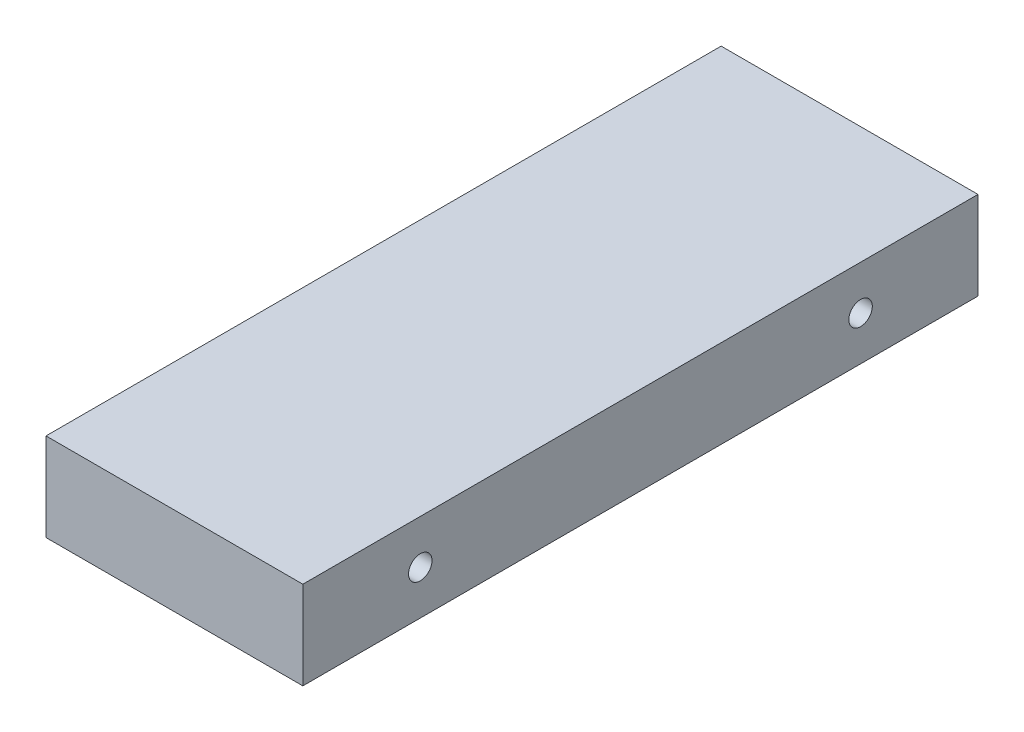
ISO-10303-21;
HEADER;
FILE_DESCRIPTION(('STEP AP214'),'2;1');
FILE_NAME('part.step','',(''),(''),'','','');
FILE_SCHEMA(('AUTOMOTIVE_DESIGN { 1 0 10303 214 1 1 1 1 }'));
ENDSEC;
DATA;
#1=APPLICATION_CONTEXT('core data for automotive mechanical design processes');
#2=APPLICATION_PROTOCOL_DEFINITION('international standard','automotive_design',2000,#1);
#3=PRODUCT_CONTEXT('',#1,'mechanical');
#4=PRODUCT('Part','Part','',(#3));
#5=PRODUCT_RELATED_PRODUCT_CATEGORY('part','',(#4));
#6=PRODUCT_DEFINITION_FORMATION('','',#4);
#7=PRODUCT_DEFINITION_CONTEXT('part definition',#1,'design');
#8=PRODUCT_DEFINITION('design','',#6,#7);
#9=PRODUCT_DEFINITION_SHAPE('','',#8);
#10=(LENGTH_UNIT() NAMED_UNIT(*) SI_UNIT(.MILLI.,.METRE.));
#11=(NAMED_UNIT(*) PLANE_ANGLE_UNIT() SI_UNIT($,.RADIAN.));
#12=(NAMED_UNIT(*) SI_UNIT($,.STERADIAN.) SOLID_ANGLE_UNIT());
#13=UNCERTAINTY_MEASURE_WITH_UNIT(LENGTH_MEASURE(1.E-05),#10,'distance_accuracy_value','');
#14=(GEOMETRIC_REPRESENTATION_CONTEXT(3) GLOBAL_UNCERTAINTY_ASSIGNED_CONTEXT((#13)) GLOBAL_UNIT_ASSIGNED_CONTEXT((#10,
#11,#12)) REPRESENTATION_CONTEXT('',''));
#15=CARTESIAN_POINT('',(0.,0.,0.));
#16=DIRECTION('',(0.,0.,1.));
#17=DIRECTION('',(1.,0.,0.));
#18=AXIS2_PLACEMENT_3D('',#15,#16,#17);
#19=CARTESIAN_POINT('',(35.,6.,46.));
#20=DIRECTION('',(0.,1.,0.));
#21=DIRECTION('',(0.,0.,1.));
#22=AXIS2_PLACEMENT_3D('',#19,#20,#21);
#23=PLANE('',#22);
#24=DIRECTION('',(0.,0.,-1.));
#25=VECTOR('',#24,1.);
#26=CARTESIAN_POINT('',(0.,6.,46.));
#27=LINE('',#26,#25);
#28=CARTESIAN_POINT('',(0.,6.,46.));
#29=VERTEX_POINT('',#28);
#30=CARTESIAN_POINT('',(0.,6.,-46.));
#31=VERTEX_POINT('',#30);
#32=EDGE_CURVE('E101',#29,#31,#27,.T.);
#33=ORIENTED_EDGE('',*,*,#32,.F.);
#34=DIRECTION('',(-1.,0.,0.));
#35=VECTOR('',#34,1.);
#36=CARTESIAN_POINT('',(35.,6.,46.));
#37=LINE('',#36,#35);
#38=CARTESIAN_POINT('',(35.,6.,46.));
#39=VERTEX_POINT('',#38);
#40=EDGE_CURVE('E11',#39,#29,#37,.T.);
#41=ORIENTED_EDGE('',*,*,#40,.F.);
#42=DIRECTION('',(0.,0.,-1.));
#43=VECTOR('',#42,1.);
#44=CARTESIAN_POINT('',(35.,6.,46.));
#45=LINE('',#44,#43);
#46=CARTESIAN_POINT('',(35.,6.,-46.));
#47=VERTEX_POINT('',#46);
#48=EDGE_CURVE('E95',#39,#47,#45,.T.);
#49=ORIENTED_EDGE('',*,*,#48,.T.);
#50=DIRECTION('',(-1.,0.,0.));
#51=VECTOR('',#50,1.);
#52=CARTESIAN_POINT('',(35.,6.,-46.));
#53=LINE('',#52,#51);
#54=EDGE_CURVE('E74',#47,#31,#53,.T.);
#55=ORIENTED_EDGE('',*,*,#54,.T.);
#56=EDGE_LOOP('',(#33,#41,#49,#55));
#57=FACE_BOUND('',#56,.T.);
#58=ADVANCED_FACE('F33',(#57),#23,.T.);
#59=CARTESIAN_POINT('',(35.,6.,46.));
#60=DIRECTION('',(0.,0.,-1.));
#61=DIRECTION('',(-1.,0.,0.));
#62=AXIS2_PLACEMENT_3D('',#59,#60,#61);
#63=PLANE('',#62);
#64=DIRECTION('',(0.,-1.,0.));
#65=VECTOR('',#64,1.);
#66=CARTESIAN_POINT('',(0.,6.,46.));
#67=LINE('',#66,#65);
#68=CARTESIAN_POINT('',(0.,-6.,46.));
#69=VERTEX_POINT('',#68);
#70=EDGE_CURVE('E66',#29,#69,#67,.T.);
#71=ORIENTED_EDGE('',*,*,#70,.T.);
#72=DIRECTION('',(-1.,0.,0.));
#73=VECTOR('',#72,1.);
#74=CARTESIAN_POINT('',(35.,-6.,46.));
#75=LINE('',#74,#73);
#76=CARTESIAN_POINT('',(35.,-6.,46.));
#77=VERTEX_POINT('',#76);
#78=EDGE_CURVE('E42',#77,#69,#75,.T.);
#79=ORIENTED_EDGE('',*,*,#78,.F.);
#80=DIRECTION('',(0.,-1.,0.));
#81=VECTOR('',#80,1.);
#82=CARTESIAN_POINT('',(35.,6.,46.));
#83=LINE('',#82,#81);
#84=EDGE_CURVE('E84',#39,#77,#83,.T.);
#85=ORIENTED_EDGE('',*,*,#84,.F.);
#86=ORIENTED_EDGE('',*,*,#40,.T.);
#87=EDGE_LOOP('',(#71,#79,#85,#86));
#88=FACE_BOUND('',#87,.T.);
#89=ADVANCED_FACE('F159',(#88),#63,.F.);
#90=CARTESIAN_POINT('',(35.,-6.,46.));
#91=DIRECTION('',(0.,1.,0.));
#92=DIRECTION('',(0.,0.,1.));
#93=AXIS2_PLACEMENT_3D('',#90,#91,#92);
#94=PLANE('',#93);
#95=DIRECTION('',(0.,0.,-1.));
#96=VECTOR('',#95,1.);
#97=CARTESIAN_POINT('',(0.,-6.,46.));
#98=LINE('',#97,#96);
#99=CARTESIAN_POINT('',(0.,-6.,-46.));
#100=VERTEX_POINT('',#99);
#101=EDGE_CURVE('E91',#69,#100,#98,.T.);
#102=ORIENTED_EDGE('',*,*,#101,.T.);
#103=DIRECTION('',(-1.,0.,0.));
#104=VECTOR('',#103,1.);
#105=CARTESIAN_POINT('',(35.,-6.,-46.));
#106=LINE('',#105,#104);
#107=CARTESIAN_POINT('',(35.,-6.,-46.));
#108=VERTEX_POINT('',#107);
#109=EDGE_CURVE('E88',#108,#100,#106,.T.);
#110=ORIENTED_EDGE('',*,*,#109,.F.);
#111=DIRECTION('',(0.,0.,-1.));
#112=VECTOR('',#111,1.);
#113=CARTESIAN_POINT('',(35.,-6.,46.));
#114=LINE('',#113,#112);
#115=EDGE_CURVE('E79',#77,#108,#114,.T.);
#116=ORIENTED_EDGE('',*,*,#115,.F.);
#117=ORIENTED_EDGE('',*,*,#78,.T.);
#118=EDGE_LOOP('',(#102,#110,#116,#117));
#119=FACE_BOUND('',#118,.T.);
#120=ADVANCED_FACE('F89',(#119),#94,.F.);
#121=CARTESIAN_POINT('',(35.,6.,-46.));
#122=DIRECTION('',(0.,0.,-1.));
#123=DIRECTION('',(-1.,0.,0.));
#124=AXIS2_PLACEMENT_3D('',#121,#122,#123);
#125=PLANE('',#124);
#126=DIRECTION('',(0.,-1.,0.));
#127=VECTOR('',#126,1.);
#128=CARTESIAN_POINT('',(0.,6.,-46.));
#129=LINE('',#128,#127);
#130=EDGE_CURVE('E104',#31,#100,#129,.T.);
#131=ORIENTED_EDGE('',*,*,#130,.F.);
#132=ORIENTED_EDGE('',*,*,#54,.F.);
#133=DIRECTION('',(0.,-1.,0.));
#134=VECTOR('',#133,1.);
#135=CARTESIAN_POINT('',(35.,6.,-46.));
#136=LINE('',#135,#134);
#137=EDGE_CURVE('E83',#47,#108,#136,.T.);
#138=ORIENTED_EDGE('',*,*,#137,.T.);
#139=ORIENTED_EDGE('',*,*,#109,.T.);
#140=EDGE_LOOP('',(#131,#132,#138,#139));
#141=FACE_BOUND('',#140,.T.);
#142=ADVANCED_FACE('F94',(#141),#125,.T.);
#143=CARTESIAN_POINT('',(35.,0.,0.));
#144=DIRECTION('',(-1.,0.,0.));
#145=DIRECTION('',(0.,0.,1.));
#146=AXIS2_PLACEMENT_3D('',#143,#144,#145);
#147=PLANE('',#146);
#148=CARTESIAN_POINT('',(35.,0.,-30.));
#149=DIRECTION('',(1.,0.,0.));
#150=DIRECTION('',(0.,0.,-1.));
#151=AXIS2_PLACEMENT_3D('',#148,#149,#150);
#152=CIRCLE('',#151,1.60000000000001);
#153=CARTESIAN_POINT('',(35.,0.,-31.6));
#154=VERTEX_POINT('',#153);
#155=EDGE_CURVE('E112',#154,#154,#152,.T.);
#156=ORIENTED_EDGE('',*,*,#155,.F.);
#157=EDGE_LOOP('',(#156));
#158=FACE_BOUND('',#157,.T.);
#159=CARTESIAN_POINT('',(35.,0.,30.));
#160=DIRECTION('',(1.,0.,0.));
#161=DIRECTION('',(0.,0.,-1.));
#162=AXIS2_PLACEMENT_3D('',#159,#160,#161);
#163=CIRCLE('',#162,1.6);
#164=CARTESIAN_POINT('',(35.,0.,28.4));
#165=VERTEX_POINT('',#164);
#166=EDGE_CURVE('E118',#165,#165,#163,.T.);
#167=ORIENTED_EDGE('',*,*,#166,.F.);
#168=EDGE_LOOP('',(#167));
#169=FACE_BOUND('',#168,.T.);
#170=ORIENTED_EDGE('',*,*,#48,.F.);
#171=ORIENTED_EDGE('',*,*,#84,.T.);
#172=ORIENTED_EDGE('',*,*,#115,.T.);
#173=ORIENTED_EDGE('',*,*,#137,.F.);
#174=EDGE_LOOP('',(#170,#171,#172,#173));
#175=FACE_BOUND('',#174,.T.);
#176=ADVANCED_FACE('F82',(#158,#169,#175),#147,.F.);
#177=CARTESIAN_POINT('',(0.,0.,0.));
#178=DIRECTION('',(-1.,0.,0.));
#179=DIRECTION('',(0.,0.,1.));
#180=AXIS2_PLACEMENT_3D('',#177,#178,#179);
#181=PLANE('',#180);
#182=CARTESIAN_POINT('',(0.,0.,-42.));
#183=DIRECTION('',(1.,0.,0.));
#184=DIRECTION('',(0.,0.,-1.));
#185=AXIS2_PLACEMENT_3D('',#182,#183,#184);
#186=CIRCLE('',#185,1.621);
#187=CARTESIAN_POINT('',(0.,0.,-43.621));
#188=VERTEX_POINT('',#187);
#189=EDGE_CURVE('E272',#188,#188,#186,.T.);
#190=ORIENTED_EDGE('',*,*,#189,.T.);
#191=EDGE_LOOP('',(#190));
#192=FACE_BOUND('',#191,.T.);
#193=CARTESIAN_POINT('',(0.,0.,42.));
#194=DIRECTION('',(1.,0.,0.));
#195=DIRECTION('',(0.,0.,-1.));
#196=AXIS2_PLACEMENT_3D('',#193,#194,#195);
#197=CIRCLE('',#196,1.621);
#198=CARTESIAN_POINT('',(0.,0.,40.379));
#199=VERTEX_POINT('',#198);
#200=EDGE_CURVE('E274',#199,#199,#197,.T.);
#201=ORIENTED_EDGE('',*,*,#200,.T.);
#202=EDGE_LOOP('',(#201));
#203=FACE_BOUND('',#202,.T.);
#204=CARTESIAN_POINT('',(0.,0.,30.));
#205=DIRECTION('',(1.,0.,0.));
#206=DIRECTION('',(0.,0.,-1.));
#207=AXIS2_PLACEMENT_3D('',#204,#205,#206);
#208=CIRCLE('',#207,4.);
#209=CARTESIAN_POINT('',(0.,0.,26.));
#210=VERTEX_POINT('',#209);
#211=EDGE_CURVE('E131',#210,#210,#208,.T.);
#212=ORIENTED_EDGE('',*,*,#211,.T.);
#213=EDGE_LOOP('',(#212));
#214=FACE_BOUND('',#213,.T.);
#215=CARTESIAN_POINT('',(0.,0.,-30.));
#216=DIRECTION('',(1.,0.,0.));
#217=DIRECTION('',(0.,0.,-1.));
#218=AXIS2_PLACEMENT_3D('',#215,#216,#217);
#219=CIRCLE('',#218,4.);
#220=CARTESIAN_POINT('',(0.,0.,-34.));
#221=VERTEX_POINT('',#220);
#222=EDGE_CURVE('E134',#221,#221,#219,.T.);
#223=ORIENTED_EDGE('',*,*,#222,.T.);
#224=EDGE_LOOP('',(#223));
#225=FACE_BOUND('',#224,.T.);
#226=ORIENTED_EDGE('',*,*,#32,.T.);
#227=ORIENTED_EDGE('',*,*,#130,.T.);
#228=ORIENTED_EDGE('',*,*,#101,.F.);
#229=ORIENTED_EDGE('',*,*,#70,.F.);
#230=EDGE_LOOP('',(#226,#227,#228,#229));
#231=FACE_BOUND('',#230,.T.);
#232=ADVANCED_FACE('F154',(#192,#203,#214,#225,#231),#181,.T.);
#233=CARTESIAN_POINT('',(27.,0.,-30.));
#234=DIRECTION('',(-1.,0.,0.));
#235=DIRECTION('',(0.,0.,1.));
#236=AXIS2_PLACEMENT_3D('',#233,#234,#235);
#237=CYLINDRICAL_SURFACE('',#236,4.);
#238=CARTESIAN_POINT('',(27.,0.,-30.));
#239=DIRECTION('',(1.,0.,0.));
#240=DIRECTION('',(0.,0.,-1.));
#241=AXIS2_PLACEMENT_3D('',#238,#239,#240);
#242=CIRCLE('',#241,4.);
#243=CARTESIAN_POINT('',(27.,0.,-34.));
#244=VERTEX_POINT('',#243);
#245=EDGE_CURVE('E116',#244,#244,#242,.T.);
#246=ORIENTED_EDGE('',*,*,#245,.T.);
#247=EDGE_LOOP('',(#246));
#248=FACE_BOUND('',#247,.T.);
#249=ORIENTED_EDGE('',*,*,#222,.F.);
#250=EDGE_LOOP('',(#249));
#251=FACE_BOUND('',#250,.T.);
#252=ADVANCED_FACE('F139',(#248,#251),#237,.F.);
#253=CARTESIAN_POINT('',(27.,0.,-30.));
#254=DIRECTION('',(1.,0.,0.));
#255=DIRECTION('',(0.,0.,-1.));
#256=AXIS2_PLACEMENT_3D('',#253,#254,#255);
#257=PLANE('',#256);
#258=CARTESIAN_POINT('',(27.,0.,-30.));
#259=DIRECTION('',(1.,0.,0.));
#260=DIRECTION('',(0.,0.,-1.));
#261=AXIS2_PLACEMENT_3D('',#258,#259,#260);
#262=CIRCLE('',#261,1.60000000000001);
#263=CARTESIAN_POINT('',(27.,0.,-31.6));
#264=VERTEX_POINT('',#263);
#265=EDGE_CURVE('E36',#264,#264,#262,.F.);
#266=ORIENTED_EDGE('',*,*,#265,.F.);
#267=EDGE_LOOP('',(#266));
#268=FACE_BOUND('',#267,.T.);
#269=ORIENTED_EDGE('',*,*,#245,.F.);
#270=EDGE_LOOP('',(#269));
#271=FACE_BOUND('',#270,.T.);
#272=ADVANCED_FACE('F142',(#268,#271),#257,.F.);
#273=CARTESIAN_POINT('',(27.,0.,30.));
#274=DIRECTION('',(-1.,0.,0.));
#275=DIRECTION('',(0.,0.,1.));
#276=AXIS2_PLACEMENT_3D('',#273,#274,#275);
#277=CYLINDRICAL_SURFACE('',#276,4.);
#278=CARTESIAN_POINT('',(27.,0.,30.));
#279=DIRECTION('',(1.,0.,0.));
#280=DIRECTION('',(0.,0.,-1.));
#281=AXIS2_PLACEMENT_3D('',#278,#279,#280);
#282=CIRCLE('',#281,4.);
#283=CARTESIAN_POINT('',(27.,0.,26.));
#284=VERTEX_POINT('',#283);
#285=EDGE_CURVE('E105',#284,#284,#282,.T.);
#286=ORIENTED_EDGE('',*,*,#285,.T.);
#287=EDGE_LOOP('',(#286));
#288=FACE_BOUND('',#287,.T.);
#289=ORIENTED_EDGE('',*,*,#211,.F.);
#290=EDGE_LOOP('',(#289));
#291=FACE_BOUND('',#290,.T.);
#292=ADVANCED_FACE('F144',(#288,#291),#277,.F.);
#293=CARTESIAN_POINT('',(27.,0.,30.));
#294=DIRECTION('',(1.,0.,0.));
#295=DIRECTION('',(0.,0.,-1.));
#296=AXIS2_PLACEMENT_3D('',#293,#294,#295);
#297=PLANE('',#296);
#298=CARTESIAN_POINT('',(27.,0.,30.));
#299=DIRECTION('',(1.,0.,0.));
#300=DIRECTION('',(0.,0.,-1.));
#301=AXIS2_PLACEMENT_3D('',#298,#299,#300);
#302=CIRCLE('',#301,1.6);
#303=CARTESIAN_POINT('',(27.,0.,28.4));
#304=VERTEX_POINT('',#303);
#305=EDGE_CURVE('E110',#304,#304,#302,.F.);
#306=ORIENTED_EDGE('',*,*,#305,.F.);
#307=EDGE_LOOP('',(#306));
#308=FACE_BOUND('',#307,.T.);
#309=ORIENTED_EDGE('',*,*,#285,.F.);
#310=EDGE_LOOP('',(#309));
#311=FACE_BOUND('',#310,.T.);
#312=ADVANCED_FACE('F151',(#308,#311),#297,.F.);
#313=CARTESIAN_POINT('',(35.,0.,30.));
#314=DIRECTION('',(-1.,0.,0.));
#315=DIRECTION('',(0.,0.,1.));
#316=AXIS2_PLACEMENT_3D('',#313,#314,#315);
#317=CYLINDRICAL_SURFACE('',#316,1.6);
#318=ORIENTED_EDGE('',*,*,#166,.T.);
#319=EDGE_LOOP('',(#318));
#320=FACE_BOUND('',#319,.T.);
#321=ORIENTED_EDGE('',*,*,#305,.T.);
#322=EDGE_LOOP('',(#321));
#323=FACE_BOUND('',#322,.T.);
#324=ADVANCED_FACE('F204',(#320,#323),#317,.F.);
#325=CARTESIAN_POINT('',(35.,0.,-30.));
#326=DIRECTION('',(-1.,0.,0.));
#327=DIRECTION('',(0.,0.,1.));
#328=AXIS2_PLACEMENT_3D('',#325,#326,#327);
#329=CYLINDRICAL_SURFACE('',#328,1.60000000000001);
#330=ORIENTED_EDGE('',*,*,#155,.T.);
#331=EDGE_LOOP('',(#330));
#332=FACE_BOUND('',#331,.T.);
#333=ORIENTED_EDGE('',*,*,#265,.T.);
#334=EDGE_LOOP('',(#333));
#335=FACE_BOUND('',#334,.T.);
#336=ADVANCED_FACE('F214',(#332,#335),#329,.F.);
#337=CARTESIAN_POINT('',(12.,0.,42.));
#338=DIRECTION('',(-1.,0.,0.));
#339=DIRECTION('',(0.,0.,1.));
#340=AXIS2_PLACEMENT_3D('',#337,#338,#339);
#341=CYLINDRICAL_SURFACE('',#340,1.621);
#342=CARTESIAN_POINT('',(12.,0.,42.));
#343=DIRECTION('',(1.,0.,0.));
#344=DIRECTION('',(0.,0.,-1.));
#345=AXIS2_PLACEMENT_3D('',#342,#343,#344);
#346=CIRCLE('',#345,1.621);
#347=CARTESIAN_POINT('',(12.,0.,40.379));
#348=VERTEX_POINT('',#347);
#349=EDGE_CURVE('E126',#348,#348,#346,.T.);
#350=ORIENTED_EDGE('',*,*,#349,.T.);
#351=EDGE_LOOP('',(#350));
#352=FACE_BOUND('',#351,.T.);
#353=ORIENTED_EDGE('',*,*,#200,.F.);
#354=EDGE_LOOP('',(#353));
#355=FACE_BOUND('',#354,.T.);
#356=ADVANCED_FACE('F223',(#352,#355),#341,.F.);
#357=CARTESIAN_POINT('',(12.,0.,42.));
#358=DIRECTION('',(1.,0.,0.));
#359=DIRECTION('',(0.,0.,-1.));
#360=AXIS2_PLACEMENT_3D('',#357,#358,#359);
#361=PLANE('',#360);
#362=ORIENTED_EDGE('',*,*,#349,.F.);
#363=EDGE_LOOP('',(#362));
#364=FACE_BOUND('',#363,.T.);
#365=ADVANCED_FACE('F236',(#364),#361,.F.);
#366=CARTESIAN_POINT('',(12.,0.,-42.));
#367=DIRECTION('',(-1.,0.,0.));
#368=DIRECTION('',(0.,0.,1.));
#369=AXIS2_PLACEMENT_3D('',#366,#367,#368);
#370=CYLINDRICAL_SURFACE('',#369,1.621);
#371=CARTESIAN_POINT('',(12.,0.,-42.));
#372=DIRECTION('',(1.,0.,0.));
#373=DIRECTION('',(0.,0.,-1.));
#374=AXIS2_PLACEMENT_3D('',#371,#372,#373);
#375=CIRCLE('',#374,1.621);
#376=CARTESIAN_POINT('',(12.,0.,-43.621));
#377=VERTEX_POINT('',#376);
#378=EDGE_CURVE('E123',#377,#377,#375,.T.);
#379=ORIENTED_EDGE('',*,*,#378,.T.);
#380=EDGE_LOOP('',(#379));
#381=FACE_BOUND('',#380,.T.);
#382=ORIENTED_EDGE('',*,*,#189,.F.);
#383=EDGE_LOOP('',(#382));
#384=FACE_BOUND('',#383,.T.);
#385=ADVANCED_FACE('F246',(#381,#384),#370,.F.);
#386=CARTESIAN_POINT('',(12.,0.,-42.));
#387=DIRECTION('',(1.,0.,0.));
#388=DIRECTION('',(0.,0.,-1.));
#389=AXIS2_PLACEMENT_3D('',#386,#387,#388);
#390=PLANE('',#389);
#391=ORIENTED_EDGE('',*,*,#378,.F.);
#392=EDGE_LOOP('',(#391));
#393=FACE_BOUND('',#392,.T.);
#394=ADVANCED_FACE('F256',(#393),#390,.F.);
#395=CLOSED_SHELL('',(#58,#89,#120,#142,#176,#232,#252,#272,#292,#312,#324,#336,#356,#365,#385,#394));
#396=MANIFOLD_SOLID_BREP('B2',#395);
#397=ADVANCED_BREP_SHAPE_REPRESENTATION('',(#18,#396),#14);
#398=SHAPE_DEFINITION_REPRESENTATION(#9,#397);
ENDSEC;
END-ISO-10303-21;
